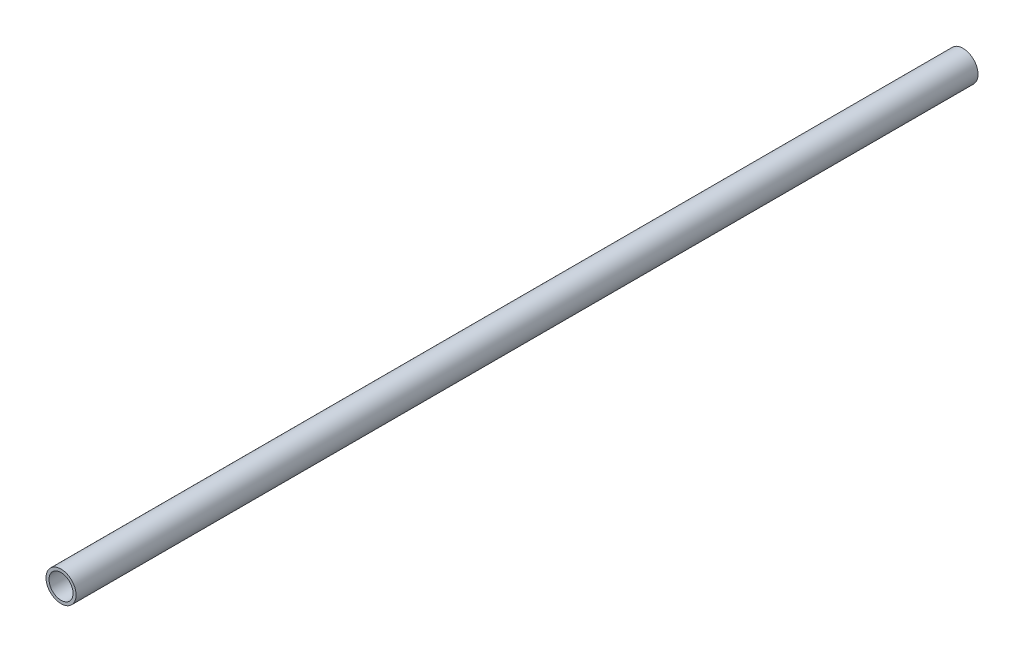
ISO-10303-21;
HEADER;
FILE_DESCRIPTION(('STEP AP214'),'2;1');
FILE_NAME('part.step','',(''),(''),'','','');
FILE_SCHEMA(('AUTOMOTIVE_DESIGN { 1 0 10303 214 1 1 1 1 }'));
ENDSEC;
DATA;
#1=APPLICATION_CONTEXT('core data for automotive mechanical design processes');
#2=APPLICATION_PROTOCOL_DEFINITION('international standard','automotive_design',2000,#1);
#3=PRODUCT_CONTEXT('',#1,'mechanical');
#4=PRODUCT('Part','Part','',(#3));
#5=PRODUCT_RELATED_PRODUCT_CATEGORY('part','',(#4));
#6=PRODUCT_DEFINITION_FORMATION('','',#4);
#7=PRODUCT_DEFINITION_CONTEXT('part definition',#1,'design');
#8=PRODUCT_DEFINITION('design','',#6,#7);
#9=PRODUCT_DEFINITION_SHAPE('','',#8);
#10=(LENGTH_UNIT() NAMED_UNIT(*) SI_UNIT(.MILLI.,.METRE.));
#11=(NAMED_UNIT(*) PLANE_ANGLE_UNIT() SI_UNIT($,.RADIAN.));
#12=(NAMED_UNIT(*) SI_UNIT($,.STERADIAN.) SOLID_ANGLE_UNIT());
#13=UNCERTAINTY_MEASURE_WITH_UNIT(LENGTH_MEASURE(1.E-05),#10,'distance_accuracy_value','');
#14=(GEOMETRIC_REPRESENTATION_CONTEXT(3) GLOBAL_UNCERTAINTY_ASSIGNED_CONTEXT((#13)) GLOBAL_UNIT_ASSIGNED_CONTEXT((#10,
#11,#12)) REPRESENTATION_CONTEXT('',''));
#15=CARTESIAN_POINT('',(0.,0.,0.));
#16=DIRECTION('',(0.,0.,1.));
#17=DIRECTION('',(1.,0.,0.));
#18=AXIS2_PLACEMENT_3D('',#15,#16,#17);
#19=CARTESIAN_POINT('',(0.,0.,300.));
#20=DIRECTION('',(0.,0.,-1.));
#21=DIRECTION('',(-1.,0.,0.));
#22=AXIS2_PLACEMENT_3D('',#19,#20,#21);
#23=CYLINDRICAL_SURFACE('',#22,4.);
#24=CARTESIAN_POINT('',(0.,0.,300.));
#25=DIRECTION('',(0.,0.,-1.));
#26=DIRECTION('',(-1.,0.,0.));
#27=AXIS2_PLACEMENT_3D('',#24,#25,#26);
#28=CIRCLE('',#27,4.);
#29=CARTESIAN_POINT('',(-4.,0.,300.));
#30=VERTEX_POINT('',#29);
#31=EDGE_CURVE('E18',#30,#30,#28,.T.);
#32=ORIENTED_EDGE('',*,*,#31,.F.);
#33=EDGE_LOOP('',(#32));
#34=FACE_BOUND('',#33,.T.);
#35=CARTESIAN_POINT('',(0.,0.,0.));
#36=DIRECTION('',(0.,0.,-1.));
#37=DIRECTION('',(-1.,0.,0.));
#38=AXIS2_PLACEMENT_3D('',#35,#36,#37);
#39=CIRCLE('',#38,4.);
#40=CARTESIAN_POINT('',(-4.,0.,0.));
#41=VERTEX_POINT('',#40);
#42=EDGE_CURVE('E27',#41,#41,#39,.T.);
#43=ORIENTED_EDGE('',*,*,#42,.T.);
#44=EDGE_LOOP('',(#43));
#45=FACE_BOUND('',#44,.T.);
#46=ADVANCED_FACE('F15',(#34,#45),#23,.F.);
#47=CARTESIAN_POINT('',(-5.06,-5.06,300.));
#48=DIRECTION('',(0.,0.,1.));
#49=DIRECTION('',(1.,0.,0.));
#50=AXIS2_PLACEMENT_3D('',#47,#48,#49);
#51=PLANE('',#50);
#52=CARTESIAN_POINT('',(0.,0.,300.));
#53=DIRECTION('',(0.,0.,-1.));
#54=DIRECTION('',(-1.,0.,0.));
#55=AXIS2_PLACEMENT_3D('',#52,#53,#54);
#56=CIRCLE('',#55,5.);
#57=CARTESIAN_POINT('',(-5.,0.,300.));
#58=VERTEX_POINT('',#57);
#59=EDGE_CURVE('E22',#58,#58,#56,.T.);
#60=ORIENTED_EDGE('',*,*,#59,.F.);
#61=EDGE_LOOP('',(#60));
#62=FACE_BOUND('',#61,.T.);
#63=ORIENTED_EDGE('',*,*,#31,.T.);
#64=EDGE_LOOP('',(#63));
#65=FACE_BOUND('',#64,.T.);
#66=ADVANCED_FACE('F35',(#62,#65),#51,.T.);
#67=CARTESIAN_POINT('',(-5.06,-5.06,0.));
#68=DIRECTION('',(0.,0.,1.));
#69=DIRECTION('',(1.,0.,0.));
#70=AXIS2_PLACEMENT_3D('',#67,#68,#69);
#71=PLANE('',#70);
#72=CARTESIAN_POINT('',(0.,0.,0.));
#73=DIRECTION('',(0.,0.,-1.));
#74=DIRECTION('',(-1.,0.,0.));
#75=AXIS2_PLACEMENT_3D('',#72,#73,#74);
#76=CIRCLE('',#75,5.);
#77=CARTESIAN_POINT('',(-5.,0.,0.));
#78=VERTEX_POINT('',#77);
#79=EDGE_CURVE('E10',#78,#78,#76,.F.);
#80=ORIENTED_EDGE('',*,*,#79,.F.);
#81=EDGE_LOOP('',(#80));
#82=FACE_BOUND('',#81,.T.);
#83=ORIENTED_EDGE('',*,*,#42,.F.);
#84=EDGE_LOOP('',(#83));
#85=FACE_BOUND('',#84,.T.);
#86=ADVANCED_FACE('F42',(#82,#85),#71,.F.);
#87=CARTESIAN_POINT('',(0.,0.,300.));
#88=DIRECTION('',(0.,0.,-1.));
#89=DIRECTION('',(-1.,0.,0.));
#90=AXIS2_PLACEMENT_3D('',#87,#88,#89);
#91=CYLINDRICAL_SURFACE('',#90,5.);
#92=ORIENTED_EDGE('',*,*,#79,.T.);
#93=EDGE_LOOP('',(#92));
#94=FACE_BOUND('',#93,.T.);
#95=ORIENTED_EDGE('',*,*,#59,.T.);
#96=EDGE_LOOP('',(#95));
#97=FACE_BOUND('',#96,.T.);
#98=ADVANCED_FACE('F44',(#94,#97),#91,.T.);
#99=CLOSED_SHELL('',(#46,#66,#86,#98));
#100=MANIFOLD_SOLID_BREP('B1',#99);
#101=ADVANCED_BREP_SHAPE_REPRESENTATION('',(#18,#100),#14);
#102=SHAPE_DEFINITION_REPRESENTATION(#9,#101);
ENDSEC;
END-ISO-10303-21;
